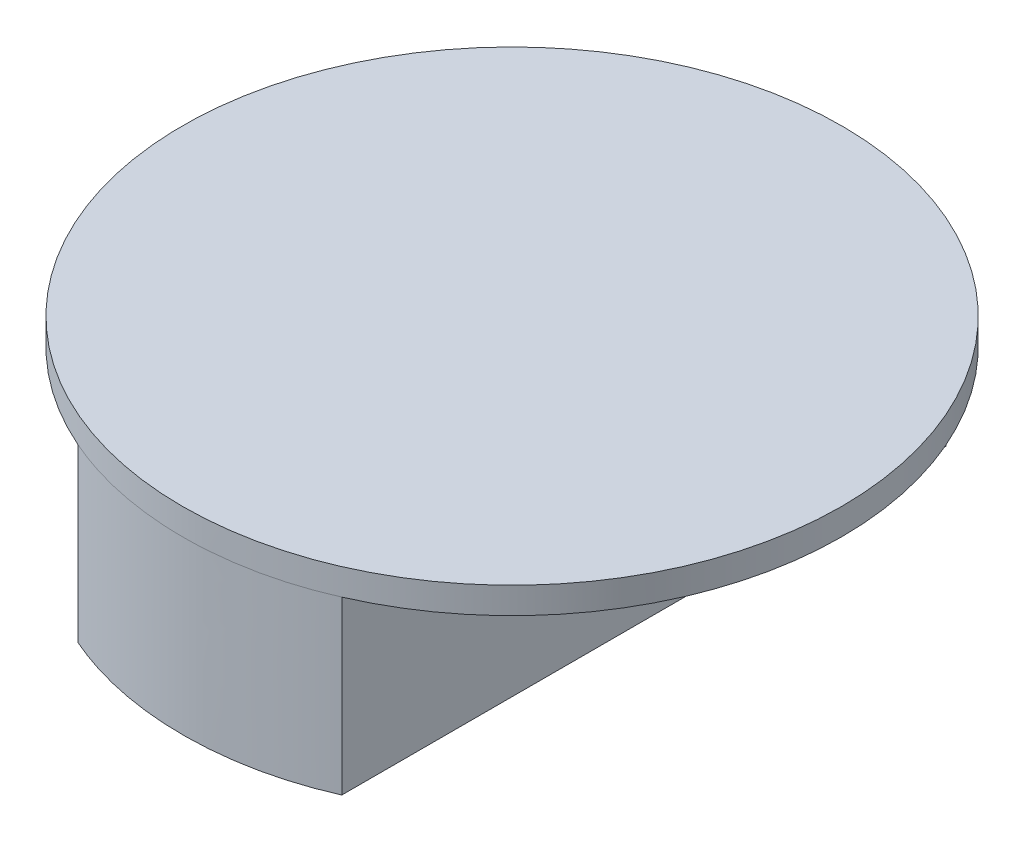
ISO-10303-21;
HEADER;
FILE_DESCRIPTION(('STEP AP214'),'2;1');
FILE_NAME('part.step','',(''),(''),'','','');
FILE_SCHEMA(('AUTOMOTIVE_DESIGN { 1 0 10303 214 1 1 1 1 }'));
ENDSEC;
DATA;
#1=APPLICATION_CONTEXT('core data for automotive mechanical design processes');
#2=APPLICATION_PROTOCOL_DEFINITION('international standard','automotive_design',2000,#1);
#3=PRODUCT_CONTEXT('',#1,'mechanical');
#4=PRODUCT('Part','Part','',(#3));
#5=PRODUCT_RELATED_PRODUCT_CATEGORY('part','',(#4));
#6=PRODUCT_DEFINITION_FORMATION('','',#4);
#7=PRODUCT_DEFINITION_CONTEXT('part definition',#1,'design');
#8=PRODUCT_DEFINITION('design','',#6,#7);
#9=PRODUCT_DEFINITION_SHAPE('','',#8);
#10=(LENGTH_UNIT() NAMED_UNIT(*) SI_UNIT(.MILLI.,.METRE.));
#11=(NAMED_UNIT(*) PLANE_ANGLE_UNIT() SI_UNIT($,.RADIAN.));
#12=(NAMED_UNIT(*) SI_UNIT($,.STERADIAN.) SOLID_ANGLE_UNIT());
#13=UNCERTAINTY_MEASURE_WITH_UNIT(LENGTH_MEASURE(1.E-05),#10,'distance_accuracy_value','');
#14=(GEOMETRIC_REPRESENTATION_CONTEXT(3) GLOBAL_UNCERTAINTY_ASSIGNED_CONTEXT((#13)) GLOBAL_UNIT_ASSIGNED_CONTEXT((#10,
#11,#12)) REPRESENTATION_CONTEXT('',''));
#15=CARTESIAN_POINT('',(0.,0.,0.));
#16=DIRECTION('',(0.,0.,1.));
#17=DIRECTION('',(1.,0.,0.));
#18=AXIS2_PLACEMENT_3D('',#15,#16,#17);
#19=CARTESIAN_POINT('',(0.,0.,0.));
#20=DIRECTION('',(0.,1.,0.));
#21=DIRECTION('',(0.,0.,1.));
#22=AXIS2_PLACEMENT_3D('',#19,#20,#21);
#23=PLANE('',#22);
#24=DIRECTION('',(0.,0.,-1.));
#25=VECTOR('',#24,1.);
#26=CARTESIAN_POINT('',(-2.54,0.,5.81987113259392));
#27=LINE('',#26,#25);
#28=CARTESIAN_POINT('',(-2.5399999911995,0.,5.81989906401124));
#29=VERTEX_POINT('',#28);
#30=CARTESIAN_POINT('',(-2.53999999226956,0.,-5.8198857179037));
#31=VERTEX_POINT('',#30);
#32=EDGE_CURVE('E53',#29,#31,#27,.T.);
#33=ORIENTED_EDGE('',*,*,#32,.F.);
#34=CARTESIAN_POINT('',(0.,0.,0.));
#35=DIRECTION('',(0.,1.,0.));
#36=DIRECTION('',(-0.399999157951368,0.,-0.916515506490859));
#37=AXIS2_PLACEMENT_3D('',#34,#35,#36);
#38=CIRCLE('',#37,6.35);
#39=EDGE_CURVE('E56',#31,#29,#38,.T.);
#40=ORIENTED_EDGE('',*,*,#39,.F.);
#41=EDGE_LOOP('',(#33,#40));
#42=FACE_BOUND('',#41,.T.);
#43=ADVANCED_FACE('F35',(#42),#23,.F.);
#44=DIRECTION('',(0.,0.,1.));
#45=VECTOR('',#44,1.);
#46=CARTESIAN_POINT('',(2.54,0.,-5.81987113259392));
#47=LINE('',#46,#45);
#48=CARTESIAN_POINT('',(2.54000000181434,0.,-5.81989905938301));
#49=VERTEX_POINT('',#48);
#50=CARTESIAN_POINT('',(2.53999999226956,0.,5.81988571790373));
#51=VERTEX_POINT('',#50);
#52=EDGE_CURVE('E203',#49,#51,#47,.T.);
#53=ORIENTED_EDGE('',*,*,#52,.F.);
#54=CARTESIAN_POINT('',(0.,0.,0.));
#55=DIRECTION('',(0.,1.,0.));
#56=DIRECTION('',(0.399999157951367,0.,0.91651550649086));
#57=AXIS2_PLACEMENT_3D('',#54,#55,#56);
#58=CIRCLE('',#57,6.35);
#59=EDGE_CURVE('E46',#51,#49,#58,.T.);
#60=ORIENTED_EDGE('',*,*,#59,.F.);
#61=EDGE_LOOP('',(#53,#60));
#62=FACE_BOUND('',#61,.T.);
#63=ADVANCED_FACE('F168',(#62),#23,.F.);
#64=CARTESIAN_POINT('',(0.,0.508,0.));
#65=DIRECTION('',(0.,-1.,0.));
#66=DIRECTION('',(0.,0.,-1.));
#67=AXIS2_PLACEMENT_3D('',#64,#65,#66);
#68=CYLINDRICAL_SURFACE('',#67,6.35);
#69=CARTESIAN_POINT('',(0.,0.508,0.));
#70=DIRECTION('',(0.,1.,0.));
#71=DIRECTION('',(0.,0.,1.));
#72=AXIS2_PLACEMENT_3D('',#69,#70,#71);
#73=CIRCLE('',#72,6.35);
#74=CARTESIAN_POINT('',(0.,0.508,6.35));
#75=VERTEX_POINT('',#74);
#76=EDGE_CURVE('E11',#75,#75,#73,.T.);
#77=ORIENTED_EDGE('',*,*,#76,.F.);
#78=EDGE_LOOP('',(#77));
#79=FACE_BOUND('',#78,.T.);
#80=ORIENTED_EDGE('',*,*,#59,.T.);
#81=CARTESIAN_POINT('',(-2.54,0.,-5.81987113259391));
#82=CARTESIAN_POINT('',(-0.951796694058601,0.,-6.51944403920278));
#83=CARTESIAN_POINT('',(0.946994971271641,0.,-6.53069271161929));
#84=CARTESIAN_POINT('',(2.54,0.,-5.81987113259392));
#85=B_SPLINE_CURVE_WITH_KNOTS('',3,(#81,#82,#83,#84),.UNSPECIFIED.,.F.,.F.,(4,4),(0.,1.),.UNSPECIFIED.);
#86=EDGE_CURVE('E101',#31,#49,#85,.T.);
#87=ORIENTED_EDGE('',*,*,#86,.F.);
#88=ORIENTED_EDGE('',*,*,#39,.T.);
#89=CARTESIAN_POINT('',(2.54,0.,5.81987113259392));
#90=CARTESIAN_POINT('',(0.946994971271641,0.,6.53069271161929));
#91=CARTESIAN_POINT('',(-0.951796694058601,0.,6.51944403920278));
#92=CARTESIAN_POINT('',(-2.54,0.,5.81987113259391));
#93=B_SPLINE_CURVE_WITH_KNOTS('',3,(#89,#90,#91,#92),.UNSPECIFIED.,.F.,.F.,(4,4),(0.,1.),.UNSPECIFIED.);
#94=EDGE_CURVE('E116',#51,#29,#93,.T.);
#95=ORIENTED_EDGE('',*,*,#94,.F.);
#96=EDGE_LOOP('',(#80,#87,#88,#95));
#97=FACE_BOUND('',#96,.T.);
#98=ADVANCED_FACE('F37',(#79,#97),#68,.T.);
#99=CARTESIAN_POINT('',(0.,0.508,0.));
#100=DIRECTION('',(0.,1.,0.));
#101=DIRECTION('',(0.,0.,1.));
#102=AXIS2_PLACEMENT_3D('',#99,#100,#101);
#103=PLANE('',#102);
#104=ORIENTED_EDGE('',*,*,#76,.T.);
#105=EDGE_LOOP('',(#104));
#106=FACE_BOUND('',#105,.T.);
#107=ADVANCED_FACE('F157',(#106),#103,.T.);
#108=CARTESIAN_POINT('',(-2.54,-3.302,-5.81987113259391));
#109=CARTESIAN_POINT('',(-0.951796694058601,-3.302,-6.51944403920278));
#110=CARTESIAN_POINT('',(0.946994971271641,-3.302,-6.53069271161929));
#111=CARTESIAN_POINT('',(2.54,-3.302,-5.81987113259392));
#112=B_SPLINE_CURVE_WITH_KNOTS('',3,(#108,#109,#110,#111),.UNSPECIFIED.,.F.,.F.,(4,4),(0.,1.),.UNSPECIFIED.);
#113=DIRECTION('',(0.,1.,0.));
#114=VECTOR('',#113,1.);
#115=SURFACE_OF_LINEAR_EXTRUSION('',#112,#114);
#116=ORIENTED_EDGE('',*,*,#86,.T.);
#117=DIRECTION('',(0.,1.,0.));
#118=VECTOR('',#117,1.);
#119=CARTESIAN_POINT('',(2.54,-3.302,-5.81987113259392));
#120=LINE('',#119,#118);
#121=CARTESIAN_POINT('',(2.54,-3.302,-5.81987113259392));
#122=VERTEX_POINT('',#121);
#123=EDGE_CURVE('E83',#122,#49,#120,.T.);
#124=ORIENTED_EDGE('',*,*,#123,.F.);
#125=CARTESIAN_POINT('',(-2.54,-3.302,-5.81987113259392));
#126=VERTEX_POINT('',#125);
#127=EDGE_CURVE('E90',#126,#122,#112,.T.);
#128=ORIENTED_EDGE('',*,*,#127,.F.);
#129=DIRECTION('',(0.,1.,0.));
#130=VECTOR('',#129,1.);
#131=CARTESIAN_POINT('',(-2.54,-3.302,-5.81987113259392));
#132=LINE('',#131,#130);
#133=EDGE_CURVE('E143',#126,#31,#132,.T.);
#134=ORIENTED_EDGE('',*,*,#133,.T.);
#135=EDGE_LOOP('',(#116,#124,#128,#134));
#136=FACE_BOUND('',#135,.T.);
#137=ADVANCED_FACE('F100',(#136),#115,.F.);
#138=CARTESIAN_POINT('',(2.54,-3.302,-5.81987113259392));
#139=DIRECTION('',(-1.,0.,0.));
#140=DIRECTION('',(0.,0.,1.));
#141=AXIS2_PLACEMENT_3D('',#138,#139,#140);
#142=PLANE('',#141);
#143=ORIENTED_EDGE('',*,*,#52,.T.);
#144=DIRECTION('',(0.,1.,0.));
#145=VECTOR('',#144,1.);
#146=CARTESIAN_POINT('',(2.54,-3.302,5.81987113259392));
#147=LINE('',#146,#145);
#148=CARTESIAN_POINT('',(2.54,-3.302,5.81987113259392));
#149=VERTEX_POINT('',#148);
#150=EDGE_CURVE('E86',#149,#51,#147,.T.);
#151=ORIENTED_EDGE('',*,*,#150,.F.);
#152=DIRECTION('',(0.,0.,1.));
#153=VECTOR('',#152,1.);
#154=CARTESIAN_POINT('',(2.54,-3.302,-5.81987113259392));
#155=LINE('',#154,#153);
#156=EDGE_CURVE('E78',#122,#149,#155,.T.);
#157=ORIENTED_EDGE('',*,*,#156,.F.);
#158=ORIENTED_EDGE('',*,*,#123,.T.);
#159=EDGE_LOOP('',(#143,#151,#157,#158));
#160=FACE_BOUND('',#159,.T.);
#161=ADVANCED_FACE('F81',(#160),#142,.F.);
#162=CARTESIAN_POINT('',(2.54,-3.302,5.81987113259392));
#163=CARTESIAN_POINT('',(0.946994971271641,-3.302,6.53069271161929));
#164=CARTESIAN_POINT('',(-0.951796694058601,-3.302,6.51944403920278));
#165=CARTESIAN_POINT('',(-2.54,-3.302,5.81987113259391));
#166=B_SPLINE_CURVE_WITH_KNOTS('',3,(#162,#163,#164,#165),.UNSPECIFIED.,.F.,.F.,(4,4),(0.,1.),.UNSPECIFIED.);
#167=DIRECTION('',(0.,1.,0.));
#168=VECTOR('',#167,1.);
#169=SURFACE_OF_LINEAR_EXTRUSION('',#166,#168);
#170=ORIENTED_EDGE('',*,*,#94,.T.);
#171=DIRECTION('',(0.,1.,0.));
#172=VECTOR('',#171,1.);
#173=CARTESIAN_POINT('',(-2.54,-3.302,5.81987113259391));
#174=LINE('',#173,#172);
#175=CARTESIAN_POINT('',(-2.54,-3.302,5.81987113259391));
#176=VERTEX_POINT('',#175);
#177=EDGE_CURVE('E104',#176,#29,#174,.T.);
#178=ORIENTED_EDGE('',*,*,#177,.F.);
#179=EDGE_CURVE('E89',#149,#176,#166,.T.);
#180=ORIENTED_EDGE('',*,*,#179,.F.);
#181=ORIENTED_EDGE('',*,*,#150,.T.);
#182=EDGE_LOOP('',(#170,#178,#180,#181));
#183=FACE_BOUND('',#182,.T.);
#184=ADVANCED_FACE('F122',(#183),#169,.F.);
#185=CARTESIAN_POINT('',(-2.54,-3.302,5.81987113259392));
#186=DIRECTION('',(1.,0.,0.));
#187=DIRECTION('',(0.,0.,-1.));
#188=AXIS2_PLACEMENT_3D('',#185,#186,#187);
#189=PLANE('',#188);
#190=ORIENTED_EDGE('',*,*,#32,.T.);
#191=ORIENTED_EDGE('',*,*,#133,.F.);
#192=DIRECTION('',(0.,0.,-1.));
#193=VECTOR('',#192,1.);
#194=CARTESIAN_POINT('',(-2.54,-3.302,5.81987113259392));
#195=LINE('',#194,#193);
#196=EDGE_CURVE('E95',#176,#126,#195,.T.);
#197=ORIENTED_EDGE('',*,*,#196,.F.);
#198=ORIENTED_EDGE('',*,*,#177,.T.);
#199=EDGE_LOOP('',(#190,#191,#197,#198));
#200=FACE_BOUND('',#199,.T.);
#201=ADVANCED_FACE('F133',(#200),#189,.F.);
#202=CARTESIAN_POINT('',(-0.00180064604511025,-3.302,-6.34876906470675));
#203=DIRECTION('',(0.,-1.,0.));
#204=DIRECTION('',(0.,0.,-1.));
#205=AXIS2_PLACEMENT_3D('',#202,#203,#204);
#206=PLANE('',#205);
#207=ORIENTED_EDGE('',*,*,#127,.T.);
#208=ORIENTED_EDGE('',*,*,#156,.T.);
#209=ORIENTED_EDGE('',*,*,#179,.T.);
#210=ORIENTED_EDGE('',*,*,#196,.T.);
#211=EDGE_LOOP('',(#207,#208,#209,#210));
#212=FACE_BOUND('',#211,.T.);
#213=ADVANCED_FACE('F93',(#212),#206,.T.);
#214=CLOSED_SHELL('',(#43,#63,#98,#107,#137,#161,#184,#201,#213));
#215=MANIFOLD_SOLID_BREP('B2',#214);
#216=ADVANCED_BREP_SHAPE_REPRESENTATION('',(#18,#215),#14);
#217=SHAPE_DEFINITION_REPRESENTATION(#9,#216);
ENDSEC;
END-ISO-10303-21;
